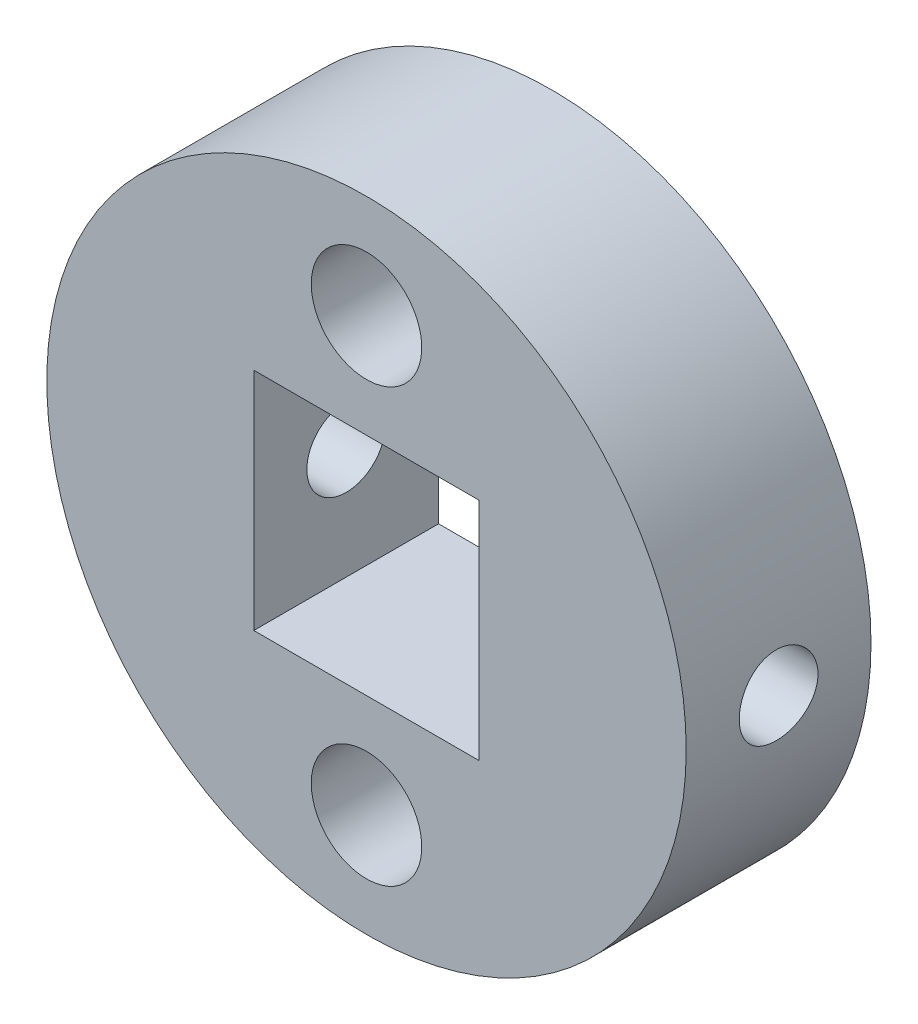
ISO-10303-21;
HEADER;
FILE_DESCRIPTION(('STEP AP214'),'2;1');
FILE_NAME('part.step','',(''),(''),'','','');
FILE_SCHEMA(('AUTOMOTIVE_DESIGN { 1 0 10303 214 1 1 1 1 }'));
ENDSEC;
DATA;
#1=APPLICATION_CONTEXT('core data for automotive mechanical design processes');
#2=APPLICATION_PROTOCOL_DEFINITION('international standard','automotive_design',2000,#1);
#3=PRODUCT_CONTEXT('',#1,'mechanical');
#4=PRODUCT('Part','Part','',(#3));
#5=PRODUCT_RELATED_PRODUCT_CATEGORY('part','',(#4));
#6=PRODUCT_DEFINITION_FORMATION('','',#4);
#7=PRODUCT_DEFINITION_CONTEXT('part definition',#1,'design');
#8=PRODUCT_DEFINITION('design','',#6,#7);
#9=PRODUCT_DEFINITION_SHAPE('','',#8);
#10=(LENGTH_UNIT() NAMED_UNIT(*) SI_UNIT(.MILLI.,.METRE.));
#11=(NAMED_UNIT(*) PLANE_ANGLE_UNIT() SI_UNIT($,.RADIAN.));
#12=(NAMED_UNIT(*) SI_UNIT($,.STERADIAN.) SOLID_ANGLE_UNIT());
#13=UNCERTAINTY_MEASURE_WITH_UNIT(LENGTH_MEASURE(1.E-05),#10,'distance_accuracy_value','');
#14=(GEOMETRIC_REPRESENTATION_CONTEXT(3) GLOBAL_UNCERTAINTY_ASSIGNED_CONTEXT((#13)) GLOBAL_UNIT_ASSIGNED_CONTEXT((#10,
#11,#12)) REPRESENTATION_CONTEXT('',''));
#15=CARTESIAN_POINT('',(0.,0.,0.));
#16=DIRECTION('',(0.,0.,1.));
#17=DIRECTION('',(1.,0.,0.));
#18=AXIS2_PLACEMENT_3D('',#15,#16,#17);
#19=CARTESIAN_POINT('',(0.,0.,6.35));
#20=DIRECTION('',(0.,0.,1.));
#21=DIRECTION('',(1.,0.,0.));
#22=AXIS2_PLACEMENT_3D('',#19,#20,#21);
#23=PLANE('',#22);
#24=CARTESIAN_POINT('',(0.,-7.4295,6.35));
#25=DIRECTION('',(0.,0.,-1.));
#26=DIRECTION('',(-1.,0.,0.));
#27=AXIS2_PLACEMENT_3D('',#24,#25,#26);
#28=CIRCLE('',#27,1.89865);
#29=CARTESIAN_POINT('',(-1.89865,-7.4295,6.35));
#30=VERTEX_POINT('',#29);
#31=EDGE_CURVE('E170',#30,#30,#28,.T.);
#32=ORIENTED_EDGE('',*,*,#31,.T.);
#33=EDGE_LOOP('',(#32));
#34=FACE_BOUND('',#33,.T.);
#35=CARTESIAN_POINT('',(0.,7.4295,6.35));
#36=DIRECTION('',(0.,0.,-1.));
#37=DIRECTION('',(-1.,0.,0.));
#38=AXIS2_PLACEMENT_3D('',#35,#36,#37);
#39=CIRCLE('',#38,1.89865);
#40=CARTESIAN_POINT('',(-1.89865,7.4295,6.35));
#41=VERTEX_POINT('',#40);
#42=EDGE_CURVE('E169',#41,#41,#39,.T.);
#43=ORIENTED_EDGE('',*,*,#42,.T.);
#44=EDGE_LOOP('',(#43));
#45=FACE_BOUND('',#44,.T.);
#46=CARTESIAN_POINT('',(0.,0.,6.35));
#47=DIRECTION('',(0.,0.,1.));
#48=DIRECTION('',(1.,0.,0.));
#49=AXIS2_PLACEMENT_3D('',#46,#47,#48);
#50=CIRCLE('',#49,10.9855);
#51=CARTESIAN_POINT('',(10.9855,0.,6.35));
#52=VERTEX_POINT('',#51);
#53=EDGE_CURVE('E118',#52,#52,#50,.T.);
#54=ORIENTED_EDGE('',*,*,#53,.T.);
#55=EDGE_LOOP('',(#54));
#56=FACE_BOUND('',#55,.T.);
#57=DIRECTION('',(-1.,0.,0.));
#58=VECTOR('',#57,1.);
#59=CARTESIAN_POINT('',(-3.8735,3.8735,6.35));
#60=LINE('',#59,#58);
#61=CARTESIAN_POINT('',(3.8735,3.8735,6.35));
#62=VERTEX_POINT('',#61);
#63=CARTESIAN_POINT('',(-3.8735,3.8735,6.35));
#64=VERTEX_POINT('',#63);
#65=EDGE_CURVE('E88',#62,#64,#60,.T.);
#66=ORIENTED_EDGE('',*,*,#65,.F.);
#67=DIRECTION('',(0.,1.,0.));
#68=VECTOR('',#67,1.);
#69=CARTESIAN_POINT('',(3.8735,-3.8735,6.35));
#70=LINE('',#69,#68);
#71=CARTESIAN_POINT('',(3.8735,-3.8735,6.35));
#72=VERTEX_POINT('',#71);
#73=EDGE_CURVE('E80',#72,#62,#70,.T.);
#74=ORIENTED_EDGE('',*,*,#73,.F.);
#75=DIRECTION('',(1.,0.,0.));
#76=VECTOR('',#75,1.);
#77=CARTESIAN_POINT('',(-3.8735,-3.8735,6.35));
#78=LINE('',#77,#76);
#79=CARTESIAN_POINT('',(-3.8735,-3.8735,6.35));
#80=VERTEX_POINT('',#79);
#81=EDGE_CURVE('E102',#80,#72,#78,.T.);
#82=ORIENTED_EDGE('',*,*,#81,.F.);
#83=DIRECTION('',(0.,-1.,0.));
#84=VECTOR('',#83,1.);
#85=CARTESIAN_POINT('',(-3.8735,-3.8735,6.35));
#86=LINE('',#85,#84);
#87=EDGE_CURVE('E100',#64,#80,#86,.T.);
#88=ORIENTED_EDGE('',*,*,#87,.F.);
#89=EDGE_LOOP('',(#66,#74,#82,#88));
#90=FACE_BOUND('',#89,.T.);
#91=ADVANCED_FACE('F35',(#34,#45,#56,#90),#23,.T.);
#92=CARTESIAN_POINT('',(0.,0.,0.));
#93=DIRECTION('',(0.,0.,1.));
#94=DIRECTION('',(1.,0.,0.));
#95=AXIS2_PLACEMENT_3D('',#92,#93,#94);
#96=PLANE('',#95);
#97=CARTESIAN_POINT('',(0.,-7.4295,0.));
#98=DIRECTION('',(0.,0.,-1.));
#99=DIRECTION('',(-1.,0.,0.));
#100=AXIS2_PLACEMENT_3D('',#97,#98,#99);
#101=CIRCLE('',#100,1.89865);
#102=CARTESIAN_POINT('',(-1.89865,-7.4295,0.));
#103=VERTEX_POINT('',#102);
#104=EDGE_CURVE('E158',#103,#103,#101,.T.);
#105=ORIENTED_EDGE('',*,*,#104,.F.);
#106=EDGE_LOOP('',(#105));
#107=FACE_BOUND('',#106,.T.);
#108=CARTESIAN_POINT('',(0.,7.4295,0.));
#109=DIRECTION('',(0.,0.,-1.));
#110=DIRECTION('',(-1.,0.,0.));
#111=AXIS2_PLACEMENT_3D('',#108,#109,#110);
#112=CIRCLE('',#111,1.89865);
#113=CARTESIAN_POINT('',(-1.89865,7.4295,0.));
#114=VERTEX_POINT('',#113);
#115=EDGE_CURVE('E162',#114,#114,#112,.T.);
#116=ORIENTED_EDGE('',*,*,#115,.F.);
#117=EDGE_LOOP('',(#116));
#118=FACE_BOUND('',#117,.T.);
#119=CARTESIAN_POINT('',(0.,0.,0.));
#120=DIRECTION('',(0.,0.,1.));
#121=DIRECTION('',(1.,0.,0.));
#122=AXIS2_PLACEMENT_3D('',#119,#120,#121);
#123=CIRCLE('',#122,10.9855);
#124=CARTESIAN_POINT('',(10.9855,0.,0.));
#125=VERTEX_POINT('',#124);
#126=EDGE_CURVE('E96',#125,#125,#123,.T.);
#127=ORIENTED_EDGE('',*,*,#126,.F.);
#128=EDGE_LOOP('',(#127));
#129=FACE_BOUND('',#128,.T.);
#130=DIRECTION('',(0.,1.,0.));
#131=VECTOR('',#130,1.);
#132=CARTESIAN_POINT('',(3.8735,-3.8735,0.));
#133=LINE('',#132,#131);
#134=CARTESIAN_POINT('',(3.8735,-3.8735,0.));
#135=VERTEX_POINT('',#134);
#136=CARTESIAN_POINT('',(3.8735,3.8735,0.));
#137=VERTEX_POINT('',#136);
#138=EDGE_CURVE('E62',#135,#137,#133,.T.);
#139=ORIENTED_EDGE('',*,*,#138,.T.);
#140=DIRECTION('',(-1.,0.,0.));
#141=VECTOR('',#140,1.);
#142=CARTESIAN_POINT('',(-3.8735,3.8735,0.));
#143=LINE('',#142,#141);
#144=CARTESIAN_POINT('',(-3.8735,3.8735,0.));
#145=VERTEX_POINT('',#144);
#146=EDGE_CURVE('E95',#137,#145,#143,.T.);
#147=ORIENTED_EDGE('',*,*,#146,.T.);
#148=DIRECTION('',(0.,-1.,0.));
#149=VECTOR('',#148,1.);
#150=CARTESIAN_POINT('',(-3.8735,-3.8735,0.));
#151=LINE('',#150,#149);
#152=CARTESIAN_POINT('',(-3.8735,-3.8735,0.));
#153=VERTEX_POINT('',#152);
#154=EDGE_CURVE('E110',#145,#153,#151,.T.);
#155=ORIENTED_EDGE('',*,*,#154,.T.);
#156=DIRECTION('',(1.,0.,0.));
#157=VECTOR('',#156,1.);
#158=CARTESIAN_POINT('',(-3.8735,-3.8735,0.));
#159=LINE('',#158,#157);
#160=EDGE_CURVE('E89',#153,#135,#159,.T.);
#161=ORIENTED_EDGE('',*,*,#160,.T.);
#162=EDGE_LOOP('',(#139,#147,#155,#161));
#163=FACE_BOUND('',#162,.T.);
#164=ADVANCED_FACE('F147',(#107,#118,#129,#163),#96,.F.);
#165=CARTESIAN_POINT('',(0.,0.,6.35));
#166=DIRECTION('',(0.,0.,-1.));
#167=DIRECTION('',(-1.,0.,0.));
#168=AXIS2_PLACEMENT_3D('',#165,#166,#167);
#169=CYLINDRICAL_SURFACE('',#168,10.9855);
#170=CARTESIAN_POINT('',(-10.9855,0.,1.82245000000001));
#171=CARTESIAN_POINT('',(-10.985498957363,0.0756662162892515,1.82245322021186));
#172=CARTESIAN_POINT('',(-10.984709975864,0.151379942554252,1.82882094142912));
#173=CARTESIAN_POINT('',(-10.9816384618443,0.300701184764233,1.85412287565918));
#174=CARTESIAN_POINT('',(-10.9793543627383,0.374306406888228,1.87307026996058));
#175=CARTESIAN_POINT('',(-10.9735499724927,0.517227243019656,1.92296540642161));
#176=CARTESIAN_POINT('',(-10.9700305065537,0.586545684246488,1.95390513937142));
#177=CARTESIAN_POINT('',(-10.9621469922232,0.71899296324033,2.02688932930371));
#178=CARTESIAN_POINT('',(-10.9577830906441,0.782122874066539,2.06893185643231));
#179=CARTESIAN_POINT('',(-10.9486719690168,0.900752004222969,2.16316864625308));
#180=CARTESIAN_POINT('',(-10.9439230188851,0.956213365972777,2.21541040312885));
#181=CARTESIAN_POINT('',(-10.9345910150808,1.05760506470752,2.32846077026844));
#182=CARTESIAN_POINT('',(-10.9300079698058,1.1035349197966,2.38926981341804));
#183=CARTESIAN_POINT('',(-10.9215096106737,1.18470031478497,2.51797394252124));
#184=CARTESIAN_POINT('',(-10.9175965239231,1.21990047795271,2.58589149801702));
#185=CARTESIAN_POINT('',(-10.9109038561484,1.27838136450854,2.72673014975643));
#186=CARTESIAN_POINT('',(-10.9081242333961,1.30166252669949,2.79965106168735));
#187=CARTESIAN_POINT('',(-10.9040296732988,1.33552971643817,2.94803404313264));
#188=CARTESIAN_POINT('',(-10.9027073727078,1.34617958568991,3.02348133458864));
#189=CARTESIAN_POINT('',(-10.9016546151378,1.35467941015745,3.17510303021034));
#190=CARTESIAN_POINT('',(-10.9019240959895,1.35252986527228,3.25127740586274));
#191=CARTESIAN_POINT('',(-10.904017715658,1.33554430280861,3.40174643573768));
#192=CARTESIAN_POINT('',(-10.905833242709,1.32077855829166,3.47604915951025));
#193=CARTESIAN_POINT('',(-10.9108009572682,1.27908936011294,3.62111402003232));
#194=CARTESIAN_POINT('',(-10.9139531711192,1.25216566684779,3.69187608697361));
#195=CARTESIAN_POINT('',(-10.9212488607713,1.18684913528334,3.82806957290694));
#196=CARTESIAN_POINT('',(-10.9253949745184,1.14842570650951,3.893486174053));
#197=CARTESIAN_POINT('',(-10.9342092467618,1.06122229554948,4.01696943795403));
#198=CARTESIAN_POINT('',(-10.9388774284228,1.01244185372596,4.07503577432654));
#199=CARTESIAN_POINT('',(-10.9482481397586,0.905519407597169,4.18257814431771));
#200=CARTESIAN_POINT('',(-10.9529506898525,0.847316821845073,4.2319939638781));
#201=CARTESIAN_POINT('',(-10.9618309693402,0.723410981534479,4.32036390388339));
#202=CARTESIAN_POINT('',(-10.9660086975844,0.657707710547477,4.35931800141369));
#203=CARTESIAN_POINT('',(-10.973371100294,0.520619528099018,4.4256585752767));
#204=CARTESIAN_POINT('',(-10.9765554560804,0.449232802556392,4.45304134046406));
#205=CARTESIAN_POINT('',(-10.9815694072985,0.302826693394582,4.49541445569743));
#206=CARTESIAN_POINT('',(-10.9833990642513,0.227807474903285,4.51040536850035));
#207=CARTESIAN_POINT('',(-10.9854894761024,0.076786607145977,4.52749133655337));
#208=CARTESIAN_POINT('',(-10.9857603235799,0.000794477815036689,4.52966935150521));
#209=CARTESIAN_POINT('',(-10.98472983342,-0.150471667753615,4.52128654388073));
#210=CARTESIAN_POINT('',(-10.983428528243,-0.225745698785651,4.51072598431938));
#211=CARTESIAN_POINT('',(-10.9794062526405,-0.37319454870657,4.47723471389979));
#212=CARTESIAN_POINT('',(-10.9766898160552,-0.445378473165177,4.45434350044147));
#213=CARTESIAN_POINT('',(-10.9701414522363,-0.584882795940893,4.39688174479581));
#214=CARTESIAN_POINT('',(-10.9663094881588,-0.652203033527449,4.36231081684235));
#215=CARTESIAN_POINT('',(-10.9579322413848,-0.780439889706667,4.28226984364084));
#216=CARTESIAN_POINT('',(-10.9533834813827,-0.841322738919962,4.23674606527089));
#217=CARTESIAN_POINT('',(-10.9440925211964,-0.954613150762994,4.13616774658086));
#218=CARTESIAN_POINT('',(-10.9393503135765,-1.00702038722132,4.08111283963814));
#219=CARTESIAN_POINT('',(-10.9301758586455,-1.10216574586961,3.96266991982286));
#220=CARTESIAN_POINT('',(-10.9257454660101,-1.1448489203689,3.89923760285575));
#221=CARTESIAN_POINT('',(-10.9177265933334,-1.21895508987927,3.76605575269222));
#222=CARTESIAN_POINT('',(-10.9141380968412,-1.25037830491825,3.69630634296981));
#223=CARTESIAN_POINT('',(-10.9082218729706,-1.30098335677853,3.55264845034915));
#224=CARTESIAN_POINT('',(-10.9058909426587,-1.32019631472361,3.47875106772464));
#225=CARTESIAN_POINT('',(-10.9027445215885,-1.3459357523905,3.3287484522286));
#226=CARTESIAN_POINT('',(-10.9019289626019,-1.35246280328493,3.25264331891585));
#227=CARTESIAN_POINT('',(-10.9019075696062,-1.35263488131563,3.10093215651525));
#228=CARTESIAN_POINT('',(-10.9026909487184,-1.34636623176684,3.02532621231655));
#229=CARTESIAN_POINT('',(-10.9057559894638,-1.32130750279951,2.87625115678073));
#230=CARTESIAN_POINT('',(-10.908037651404,-1.30251742081543,2.80278204588143));
#231=CARTESIAN_POINT('',(-10.9138388641635,-1.25297594495023,2.66007666440372));
#232=CARTESIAN_POINT('',(-10.9173579981753,-1.22222857817304,2.59083897779543));
#233=CARTESIAN_POINT('',(-10.9252383394411,-1.14965384729889,2.45849205211765));
#234=CARTESIAN_POINT('',(-10.9295995560004,-1.10782636076196,2.39538288078137));
#235=CARTESIAN_POINT('',(-10.9387079192267,-1.01395807244356,2.27664302261158));
#236=CARTESIAN_POINT('',(-10.94345738093,-0.961852922869473,2.22106337931411));
#237=CARTESIAN_POINT('',(-10.9527865819289,-0.849042246881335,2.11940316882315));
#238=CARTESIAN_POINT('',(-10.9573662808957,-0.788334693191169,2.07332484705058));
#239=CARTESIAN_POINT('',(-10.9658585550583,-0.659786097634867,1.99183111491038));
#240=CARTESIAN_POINT('',(-10.9697686043229,-0.591919541801462,1.95645570771185));
#241=CARTESIAN_POINT('',(-10.9764553067321,-0.451199383169794,1.89765388229206));
#242=CARTESIAN_POINT('',(-10.9792331945981,-0.378351314986264,1.8742144398554));
#243=CARTESIAN_POINT('',(-10.9826705918215,-0.254269465037126,1.84557997558929));
#244=CARTESIAN_POINT('',(-10.9837264691404,-0.20381908395256,1.83691864942233));
#245=CARTESIAN_POINT('',(-10.9851415230865,-0.102253032067665,1.82535259383982));
#246=CARTESIAN_POINT('',(-10.9855007046435,-0.0511373659775836,1.82244782368989));
#247=CARTESIAN_POINT('',(-10.9855,0.,1.82245000000001));
#248=B_SPLINE_CURVE_WITH_KNOTS('',3,(#170,#171,#172,#173,#174,#175,#176,#177,#178,#179,#180,
#181,#182,#183,#184,#185,#186,#187,#188,#189,#190,#191,#192,#193,#194,#195,#196,#197,#198,#199,
#200,#201,#202,#203,#204,#205,#206,#207,#208,#209,#210,#211,#212,#213,#214,#215,#216,#217,#218,
#219,#220,#221,#222,#223,#224,#225,#226,#227,#228,#229,#230,#231,#232,#233,#234,#235,#236,#237,
#238,#239,#240,#241,#242,#243,#244,#245,#246,#247),.UNSPECIFIED.,.T.,.F.,(4,2,2,2,2,2,2,2,2,2,2,
2,2,2,2,2,2,2,2,2,2,2,2,2,2,2,2,2,2,2,2,2,2,2,2,2,2,2,4),(0.,0.226811864735638,
0.453861764353082,0.680760286857207,0.907619396479579,1.13556125211483,1.36351462927464,
1.59221165570891,1.82090026196349,2.0484280254365,2.27594690255271,2.50220668498508,
2.72847092663824,2.95534248636422,3.18222411660358,3.41062712350764,3.63903063068491,
3.86750733569655,4.0959736642199,4.32295909889393,4.54993984705094,4.77619781958037,
5.00246326585366,5.22986222220812,5.45726992759339,5.68593242000035,5.91459044393052,
6.14266330905155,6.37072590514026,6.59725501387006,6.82378416901388,7.05023709719496,
7.27669252788045,7.50461356020783,7.73258839490117,7.96140507041502,8.18997152919245,
8.343258477822,8.496544341763),.UNSPECIFIED.);
#249=CARTESIAN_POINT('',(-10.9855,0.,1.82245000000001));
#250=VERTEX_POINT('',#249);
#251=EDGE_CURVE('E11',#250,#250,#248,.T.);
#252=ORIENTED_EDGE('',*,*,#251,.T.);
#253=EDGE_LOOP('',(#252));
#254=FACE_BOUND('',#253,.T.);
#255=CARTESIAN_POINT('',(10.9855,0.,4.52754999999999));
#256=CARTESIAN_POINT('',(10.985498957363,0.0756662162892515,4.52754677978814));
#257=CARTESIAN_POINT('',(10.984709975864,0.151379942554252,4.52117905857088));
#258=CARTESIAN_POINT('',(10.9816384618443,0.300701184764233,4.49587712434082));
#259=CARTESIAN_POINT('',(10.9793543627383,0.374306406888228,4.47692973003942));
#260=CARTESIAN_POINT('',(10.9735499724927,0.517227243019656,4.42703459357839));
#261=CARTESIAN_POINT('',(10.9700305065537,0.586545684246487,4.39609486062858));
#262=CARTESIAN_POINT('',(10.9621469922232,0.71899296324033,4.3231106706963));
#263=CARTESIAN_POINT('',(10.9577830906441,0.782122874066539,4.28106814356769));
#264=CARTESIAN_POINT('',(10.9486719690168,0.900752004222968,4.18683135374692));
#265=CARTESIAN_POINT('',(10.9439230188851,0.956213365972777,4.13458959687115));
#266=CARTESIAN_POINT('',(10.9345910150808,1.05760506470752,4.02153922973156));
#267=CARTESIAN_POINT('',(10.9300079698058,1.1035349197966,3.96073018658196));
#268=CARTESIAN_POINT('',(10.9215096106737,1.18470031478497,3.83202605747876));
#269=CARTESIAN_POINT('',(10.9175965239231,1.21990047795271,3.76410850198298));
#270=CARTESIAN_POINT('',(10.9109038561484,1.27838136450854,3.62326985024357));
#271=CARTESIAN_POINT('',(10.9081242333961,1.30166252669949,3.55034893831265));
#272=CARTESIAN_POINT('',(10.9040296732988,1.33552971643817,3.40196595686736));
#273=CARTESIAN_POINT('',(10.9027073727078,1.34617958568991,3.32651866541137));
#274=CARTESIAN_POINT('',(10.9016546151378,1.35467941015745,3.17489696978967));
#275=CARTESIAN_POINT('',(10.9019240959895,1.35252986527228,3.09872259413726));
#276=CARTESIAN_POINT('',(10.904017715658,1.33554430280861,2.94825356426232));
#277=CARTESIAN_POINT('',(10.905833242709,1.32077855829166,2.87395084048975));
#278=CARTESIAN_POINT('',(10.9108009572682,1.27908936011294,2.72888597996768));
#279=CARTESIAN_POINT('',(10.9139531711192,1.25216566684779,2.65812391302639));
#280=CARTESIAN_POINT('',(10.9212488607713,1.18684913528334,2.52193042709307));
#281=CARTESIAN_POINT('',(10.9253949745184,1.14842570650951,2.456513825947));
#282=CARTESIAN_POINT('',(10.9342092467618,1.06122229554948,2.33303056204598));
#283=CARTESIAN_POINT('',(10.9388774284228,1.01244185372596,2.27496422567346));
#284=CARTESIAN_POINT('',(10.9482481397586,0.905519407597169,2.16742185568229));
#285=CARTESIAN_POINT('',(10.9529506898525,0.847316821845073,2.1180060361219));
#286=CARTESIAN_POINT('',(10.9618309693402,0.723410981534479,2.02963609611661));
#287=CARTESIAN_POINT('',(10.9660086975844,0.657707710547477,1.99068199858631));
#288=CARTESIAN_POINT('',(10.973371100294,0.520619528099018,1.9243414247233));
#289=CARTESIAN_POINT('',(10.9765554560804,0.449232802556392,1.89695865953594));
#290=CARTESIAN_POINT('',(10.9815694072985,0.302826693394583,1.85458554430258));
#291=CARTESIAN_POINT('',(10.9833990642513,0.227807474903286,1.83959463149966));
#292=CARTESIAN_POINT('',(10.9854894761024,0.0767866071459776,1.82250866344663));
#293=CARTESIAN_POINT('',(10.9857603235799,0.000794477815037326,1.82033064849479));
#294=CARTESIAN_POINT('',(10.98472983342,-0.150471667753615,1.82871345611927));
#295=CARTESIAN_POINT('',(10.983428528243,-0.225745698785651,1.83927401568062));
#296=CARTESIAN_POINT('',(10.9794062526405,-0.37319454870657,1.87276528610021));
#297=CARTESIAN_POINT('',(10.9766898160552,-0.445378473165177,1.89565649955853));
#298=CARTESIAN_POINT('',(10.9701414522363,-0.584882795940893,1.95311825520419));
#299=CARTESIAN_POINT('',(10.9663094881588,-0.652203033527449,1.98768918315765));
#300=CARTESIAN_POINT('',(10.9579322413848,-0.780439889706667,2.06773015635916));
#301=CARTESIAN_POINT('',(10.9533834813827,-0.841322738919962,2.11325393472911));
#302=CARTESIAN_POINT('',(10.9440925211964,-0.954613150762994,2.21383225341914));
#303=CARTESIAN_POINT('',(10.9393503135765,-1.00702038722132,2.26888716036186));
#304=CARTESIAN_POINT('',(10.9301758586455,-1.10216574586961,2.38733008017714));
#305=CARTESIAN_POINT('',(10.9257454660101,-1.14484892036889,2.45076239714426));
#306=CARTESIAN_POINT('',(10.9177265933334,-1.21895508987927,2.58394424730778));
#307=CARTESIAN_POINT('',(10.9141380968412,-1.25037830491825,2.65369365703019));
#308=CARTESIAN_POINT('',(10.9082218729706,-1.30098335677853,2.79735154965085));
#309=CARTESIAN_POINT('',(10.9058909426587,-1.32019631472361,2.87124893227536));
#310=CARTESIAN_POINT('',(10.9027445215885,-1.3459357523905,3.0212515477714));
#311=CARTESIAN_POINT('',(10.9019289626019,-1.35246280328493,3.09735668108415));
#312=CARTESIAN_POINT('',(10.9019075696062,-1.35263488131563,3.24906784348475));
#313=CARTESIAN_POINT('',(10.9026909487184,-1.34636623176684,3.32467378768345));
#314=CARTESIAN_POINT('',(10.9057559894638,-1.32130750279951,3.47374884321927));
#315=CARTESIAN_POINT('',(10.908037651404,-1.30251742081543,3.54721795411858));
#316=CARTESIAN_POINT('',(10.9138388641635,-1.25297594495023,3.68992333559628));
#317=CARTESIAN_POINT('',(10.9173579981753,-1.22222857817304,3.75916102220457));
#318=CARTESIAN_POINT('',(10.9252383394411,-1.14965384729889,3.89150794788235));
#319=CARTESIAN_POINT('',(10.9295995560004,-1.10782636076196,3.95461711921863));
#320=CARTESIAN_POINT('',(10.9387079192267,-1.01395807244356,4.07335697738842));
#321=CARTESIAN_POINT('',(10.94345738093,-0.961852922869475,4.12893662068589));
#322=CARTESIAN_POINT('',(10.9527865819289,-0.849042246881336,4.23059683117685));
#323=CARTESIAN_POINT('',(10.9573662808957,-0.78833469319117,4.27667515294942));
#324=CARTESIAN_POINT('',(10.9658585550583,-0.659786097634868,4.35816888508962));
#325=CARTESIAN_POINT('',(10.9697686043229,-0.591919541801463,4.39354429228815));
#326=CARTESIAN_POINT('',(10.9764553067321,-0.451199383169796,4.45234611770794));
#327=CARTESIAN_POINT('',(10.9792331945981,-0.378351314986264,4.4757855601446));
#328=CARTESIAN_POINT('',(10.9826705918215,-0.254269465037126,4.50442002441071));
#329=CARTESIAN_POINT('',(10.9837264691404,-0.20381908395256,4.51308135057767));
#330=CARTESIAN_POINT('',(10.9851415230865,-0.102253032067665,4.52464740616018));
#331=CARTESIAN_POINT('',(10.9855007046435,-0.0511373659775832,4.52755217631011));
#332=CARTESIAN_POINT('',(10.9855,0.,4.52754999999999));
#333=B_SPLINE_CURVE_WITH_KNOTS('',3,(#255,#256,#257,#258,#259,#260,#261,#262,#263,#264,#265,
#266,#267,#268,#269,#270,#271,#272,#273,#274,#275,#276,#277,#278,#279,#280,#281,#282,#283,#284,
#285,#286,#287,#288,#289,#290,#291,#292,#293,#294,#295,#296,#297,#298,#299,#300,#301,#302,#303,
#304,#305,#306,#307,#308,#309,#310,#311,#312,#313,#314,#315,#316,#317,#318,#319,#320,#321,#322,
#323,#324,#325,#326,#327,#328,#329,#330,#331,#332),.UNSPECIFIED.,.T.,.F.,(4,2,2,2,2,2,2,2,2,2,2,
2,2,2,2,2,2,2,2,2,2,2,2,2,2,2,2,2,2,2,2,2,2,2,2,2,2,2,4),(0.,0.226811864735638,
0.453861764353082,0.680760286857207,0.907619396479578,1.13556125211483,1.36351462927464,
1.59221165570891,1.82090026196349,2.0484280254365,2.27594690255271,2.50220668498508,
2.72847092663824,2.95534248636422,3.18222411660358,3.41062712350764,3.63903063068491,
3.86750733569655,4.0959736642199,4.32295909889393,4.54993984705094,4.77619781958037,
5.00246326585366,5.22986222220811,5.45726992759339,5.68593242000035,5.91459044393052,
6.14266330905155,6.37072590514025,6.59725501387005,6.82378416901388,7.05023709719496,
7.27669252788044,7.50461356020782,7.73258839490117,7.96140507041502,8.18997152919245,
8.343258477822,8.49654434176299),.UNSPECIFIED.);
#334=CARTESIAN_POINT('',(10.9855,0.,4.52754999999999));
#335=VERTEX_POINT('',#334);
#336=EDGE_CURVE('E47',#335,#335,#333,.T.);
#337=ORIENTED_EDGE('',*,*,#336,.T.);
#338=EDGE_LOOP('',(#337));
#339=FACE_BOUND('',#338,.T.);
#340=ORIENTED_EDGE('',*,*,#53,.F.);
#341=EDGE_LOOP('',(#340));
#342=FACE_BOUND('',#341,.T.);
#343=ORIENTED_EDGE('',*,*,#126,.T.);
#344=EDGE_LOOP('',(#343));
#345=FACE_BOUND('',#344,.T.);
#346=ADVANCED_FACE('F37',(#254,#339,#342,#345),#169,.T.);
#347=CARTESIAN_POINT('',(3.8735,-3.8735,6.35));
#348=DIRECTION('',(-1.,0.,0.));
#349=DIRECTION('',(0.,0.,1.));
#350=AXIS2_PLACEMENT_3D('',#347,#348,#349);
#351=PLANE('',#350);
#352=CARTESIAN_POINT('',(3.8735,0.,3.175));
#353=DIRECTION('',(-1.,0.,0.));
#354=DIRECTION('',(0.,0.,1.));
#355=AXIS2_PLACEMENT_3D('',#352,#353,#354);
#356=CIRCLE('',#355,1.35254999999999);
#357=CARTESIAN_POINT('',(3.8735,0.,4.52754999999999));
#358=VERTEX_POINT('',#357);
#359=EDGE_CURVE('E108',#358,#358,#356,.T.);
#360=ORIENTED_EDGE('',*,*,#359,.F.);
#361=EDGE_LOOP('',(#360));
#362=FACE_BOUND('',#361,.T.);
#363=ORIENTED_EDGE('',*,*,#138,.F.);
#364=DIRECTION('',(0.,0.,-1.));
#365=VECTOR('',#364,1.);
#366=CARTESIAN_POINT('',(3.8735,-3.8735,6.35));
#367=LINE('',#366,#365);
#368=EDGE_CURVE('E84',#72,#135,#367,.T.);
#369=ORIENTED_EDGE('',*,*,#368,.F.);
#370=ORIENTED_EDGE('',*,*,#73,.T.);
#371=DIRECTION('',(0.,0.,-1.));
#372=VECTOR('',#371,1.);
#373=CARTESIAN_POINT('',(3.8735,3.8735,6.35));
#374=LINE('',#373,#372);
#375=EDGE_CURVE('E83',#62,#137,#374,.T.);
#376=ORIENTED_EDGE('',*,*,#375,.T.);
#377=EDGE_LOOP('',(#363,#369,#370,#376));
#378=FACE_BOUND('',#377,.T.);
#379=ADVANCED_FACE('F82',(#362,#378),#351,.T.);
#380=CARTESIAN_POINT('',(-3.8735,3.8735,6.35));
#381=DIRECTION('',(0.,-1.,0.));
#382=DIRECTION('',(0.,0.,-1.));
#383=AXIS2_PLACEMENT_3D('',#380,#381,#382);
#384=PLANE('',#383);
#385=ORIENTED_EDGE('',*,*,#146,.F.);
#386=ORIENTED_EDGE('',*,*,#375,.F.);
#387=ORIENTED_EDGE('',*,*,#65,.T.);
#388=DIRECTION('',(0.,0.,-1.));
#389=VECTOR('',#388,1.);
#390=CARTESIAN_POINT('',(-3.8735,3.8735,6.35));
#391=LINE('',#390,#389);
#392=EDGE_CURVE('E97',#64,#145,#391,.T.);
#393=ORIENTED_EDGE('',*,*,#392,.T.);
#394=EDGE_LOOP('',(#385,#386,#387,#393));
#395=FACE_BOUND('',#394,.T.);
#396=ADVANCED_FACE('F92',(#395),#384,.T.);
#397=CARTESIAN_POINT('',(-3.8735,-3.8735,6.35));
#398=DIRECTION('',(1.,0.,0.));
#399=DIRECTION('',(0.,0.,-1.));
#400=AXIS2_PLACEMENT_3D('',#397,#398,#399);
#401=PLANE('',#400);
#402=CARTESIAN_POINT('',(-3.8735,0.,3.175));
#403=DIRECTION('',(1.,0.,0.));
#404=DIRECTION('',(0.,0.,-1.));
#405=AXIS2_PLACEMENT_3D('',#402,#403,#404);
#406=CIRCLE('',#405,1.35254999999999);
#407=CARTESIAN_POINT('',(-3.8735,0.,1.82245000000001));
#408=VERTEX_POINT('',#407);
#409=EDGE_CURVE('E173',#408,#408,#406,.T.);
#410=ORIENTED_EDGE('',*,*,#409,.F.);
#411=EDGE_LOOP('',(#410));
#412=FACE_BOUND('',#411,.T.);
#413=ORIENTED_EDGE('',*,*,#154,.F.);
#414=ORIENTED_EDGE('',*,*,#392,.F.);
#415=ORIENTED_EDGE('',*,*,#87,.T.);
#416=DIRECTION('',(0.,0.,-1.));
#417=VECTOR('',#416,1.);
#418=CARTESIAN_POINT('',(-3.8735,-3.8735,6.35));
#419=LINE('',#418,#417);
#420=EDGE_CURVE('E54',#80,#153,#419,.T.);
#421=ORIENTED_EDGE('',*,*,#420,.T.);
#422=EDGE_LOOP('',(#413,#414,#415,#421));
#423=FACE_BOUND('',#422,.T.);
#424=ADVANCED_FACE('F137',(#412,#423),#401,.T.);
#425=CARTESIAN_POINT('',(-3.8735,-3.8735,6.35));
#426=DIRECTION('',(0.,1.,0.));
#427=DIRECTION('',(0.,0.,1.));
#428=AXIS2_PLACEMENT_3D('',#425,#426,#427);
#429=PLANE('',#428);
#430=ORIENTED_EDGE('',*,*,#160,.F.);
#431=ORIENTED_EDGE('',*,*,#420,.F.);
#432=ORIENTED_EDGE('',*,*,#81,.T.);
#433=ORIENTED_EDGE('',*,*,#368,.T.);
#434=EDGE_LOOP('',(#430,#431,#432,#433));
#435=FACE_BOUND('',#434,.T.);
#436=ADVANCED_FACE('F131',(#435),#429,.T.);
#437=CARTESIAN_POINT('',(3.8735,0.,3.175));
#438=DIRECTION('',(-1.,0.,0.));
#439=DIRECTION('',(0.,0.,1.));
#440=AXIS2_PLACEMENT_3D('',#437,#438,#439);
#441=CYLINDRICAL_SURFACE('',#440,1.35254999999999);
#442=ORIENTED_EDGE('',*,*,#359,.T.);
#443=EDGE_LOOP('',(#442));
#444=FACE_BOUND('',#443,.T.);
#445=ORIENTED_EDGE('',*,*,#336,.F.);
#446=EDGE_LOOP('',(#445));
#447=FACE_BOUND('',#446,.T.);
#448=ADVANCED_FACE('F126',(#444,#447),#441,.F.);
#449=CARTESIAN_POINT('',(-3.8735,0.,3.175));
#450=DIRECTION('',(1.,0.,0.));
#451=DIRECTION('',(0.,0.,-1.));
#452=AXIS2_PLACEMENT_3D('',#449,#450,#451);
#453=CYLINDRICAL_SURFACE('',#452,1.35254999999999);
#454=ORIENTED_EDGE('',*,*,#409,.T.);
#455=EDGE_LOOP('',(#454));
#456=FACE_BOUND('',#455,.T.);
#457=ORIENTED_EDGE('',*,*,#251,.F.);
#458=EDGE_LOOP('',(#457));
#459=FACE_BOUND('',#458,.T.);
#460=ADVANCED_FACE('F130',(#456,#459),#453,.F.);
#461=CARTESIAN_POINT('',(0.,7.4295,0.));
#462=DIRECTION('',(0.,0.,-1.));
#463=DIRECTION('',(-1.,0.,0.));
#464=AXIS2_PLACEMENT_3D('',#461,#462,#463);
#465=CYLINDRICAL_SURFACE('',#464,1.89865);
#466=ORIENTED_EDGE('',*,*,#42,.F.);
#467=EDGE_LOOP('',(#466));
#468=FACE_BOUND('',#467,.T.);
#469=ORIENTED_EDGE('',*,*,#115,.T.);
#470=EDGE_LOOP('',(#469));
#471=FACE_BOUND('',#470,.T.);
#472=ADVANCED_FACE('F192',(#468,#471),#465,.F.);
#473=CARTESIAN_POINT('',(0.,-7.4295,0.));
#474=DIRECTION('',(0.,0.,-1.));
#475=DIRECTION('',(-1.,0.,0.));
#476=AXIS2_PLACEMENT_3D('',#473,#474,#475);
#477=CYLINDRICAL_SURFACE('',#476,1.89865);
#478=ORIENTED_EDGE('',*,*,#31,.F.);
#479=EDGE_LOOP('',(#478));
#480=FACE_BOUND('',#479,.T.);
#481=ORIENTED_EDGE('',*,*,#104,.T.);
#482=EDGE_LOOP('',(#481));
#483=FACE_BOUND('',#482,.T.);
#484=ADVANCED_FACE('F197',(#480,#483),#477,.F.);
#485=CLOSED_SHELL('',(#91,#164,#346,#379,#396,#424,#436,#448,#460,#472,#484));
#486=MANIFOLD_SOLID_BREP('B2',#485);
#487=ADVANCED_BREP_SHAPE_REPRESENTATION('',(#18,#486),#14);
#488=SHAPE_DEFINITION_REPRESENTATION(#9,#487);
ENDSEC;
END-ISO-10303-21;
